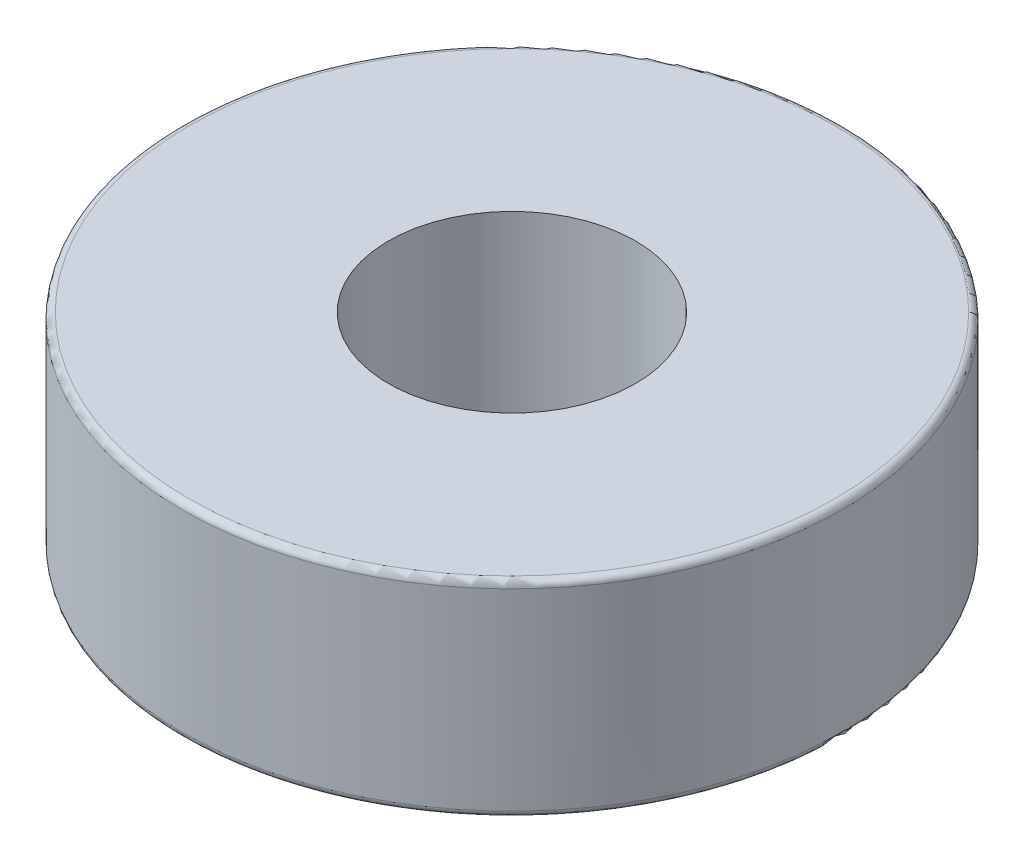
ISO-10303-21;
HEADER;
FILE_DESCRIPTION(('STEP AP214'),'2;1');
FILE_NAME('part.step','',(''),(''),'','','');
FILE_SCHEMA(('AUTOMOTIVE_DESIGN { 1 0 10303 214 1 1 1 1 }'));
ENDSEC;
DATA;
#1=APPLICATION_CONTEXT('core data for automotive mechanical design processes');
#2=APPLICATION_PROTOCOL_DEFINITION('international standard','automotive_design',2000,#1);
#3=PRODUCT_CONTEXT('',#1,'mechanical');
#4=PRODUCT('Part','Part','',(#3));
#5=PRODUCT_RELATED_PRODUCT_CATEGORY('part','',(#4));
#6=PRODUCT_DEFINITION_FORMATION('','',#4);
#7=PRODUCT_DEFINITION_CONTEXT('part definition',#1,'design');
#8=PRODUCT_DEFINITION('design','',#6,#7);
#9=PRODUCT_DEFINITION_SHAPE('','',#8);
#10=(LENGTH_UNIT() NAMED_UNIT(*) SI_UNIT(.MILLI.,.METRE.));
#11=(NAMED_UNIT(*) PLANE_ANGLE_UNIT() SI_UNIT($,.RADIAN.));
#12=(NAMED_UNIT(*) SI_UNIT($,.STERADIAN.) SOLID_ANGLE_UNIT());
#13=UNCERTAINTY_MEASURE_WITH_UNIT(LENGTH_MEASURE(1.E-05),#10,'distance_accuracy_value','');
#14=(GEOMETRIC_REPRESENTATION_CONTEXT(3) GLOBAL_UNCERTAINTY_ASSIGNED_CONTEXT((#13)) GLOBAL_UNIT_ASSIGNED_CONTEXT((#10,
#11,#12)) REPRESENTATION_CONTEXT('',''));
#15=CARTESIAN_POINT('',(0.,0.,0.));
#16=DIRECTION('',(0.,0.,1.));
#17=DIRECTION('',(1.,0.,0.));
#18=AXIS2_PLACEMENT_3D('',#15,#16,#17);
#19=CARTESIAN_POINT('',(0.,6.79943018066803,0.));
#20=DIRECTION('',(0.,-1.,0.));
#21=DIRECTION('',(0.,0.,-1.));
#22=AXIS2_PLACEMENT_3D('',#19,#20,#21);
#23=TOROIDAL_SURFACE('',#22,12.446,0.254);
#24=CARTESIAN_POINT('',(0.,6.79943018066803,0.));
#25=DIRECTION('',(0.,-1.,0.));
#26=DIRECTION('',(0.,0.,-1.));
#27=AXIS2_PLACEMENT_3D('',#24,#25,#26);
#28=CIRCLE('',#27,12.7);
#29=CARTESIAN_POINT('',(0.,6.79943018066803,-12.7));
#30=VERTEX_POINT('',#29);
#31=EDGE_CURVE('E55',#30,#30,#28,.F.);
#32=ORIENTED_EDGE('',*,*,#31,.F.);
#33=EDGE_LOOP('',(#32));
#34=FACE_BOUND('',#33,.T.);
#35=CARTESIAN_POINT('',(0.,6.54543018066803,0.));
#36=DIRECTION('',(0.,1.,0.));
#37=DIRECTION('',(0.,0.,-1.));
#38=AXIS2_PLACEMENT_3D('',#35,#36,#37);
#39=CIRCLE('',#38,12.446);
#40=CARTESIAN_POINT('',(0.,6.54543018066803,12.446));
#41=VERTEX_POINT('',#40);
#42=CARTESIAN_POINT('',(0.,6.54543018066803,-12.446));
#43=VERTEX_POINT('',#42);
#44=EDGE_CURVE('E47',#41,#43,#39,.F.);
#45=ORIENTED_EDGE('',*,*,#44,.F.);
#46=CARTESIAN_POINT('',(0.,6.54543018066803,0.));
#47=DIRECTION('',(0.,1.,0.));
#48=DIRECTION('',(0.,0.,1.));
#49=AXIS2_PLACEMENT_3D('',#46,#47,#48);
#50=CIRCLE('',#49,12.446);
#51=EDGE_CURVE('E45',#43,#41,#50,.F.);
#52=ORIENTED_EDGE('',*,*,#51,.F.);
#53=EDGE_LOOP('',(#45,#52));
#54=FACE_BOUND('',#53,.T.);
#55=ADVANCED_FACE('F17',(#34,#54),#23,.T.);
#56=CARTESIAN_POINT('',(0.,0.,0.));
#57=DIRECTION('',(0.,-1.,0.));
#58=DIRECTION('',(0.,0.,-1.));
#59=AXIS2_PLACEMENT_3D('',#56,#57,#58);
#60=CYLINDRICAL_SURFACE('',#59,12.7);
#61=CARTESIAN_POINT('',(0.,14.216230180668,0.));
#62=DIRECTION('',(0.,1.,0.));
#63=DIRECTION('',(0.,0.,1.));
#64=AXIS2_PLACEMENT_3D('',#61,#62,#63);
#65=CIRCLE('',#64,12.7);
#66=CARTESIAN_POINT('',(0.,14.216230180668,12.7));
#67=VERTEX_POINT('',#66);
#68=EDGE_CURVE('E51',#67,#67,#65,.T.);
#69=ORIENTED_EDGE('',*,*,#68,.F.);
#70=EDGE_LOOP('',(#69));
#71=FACE_BOUND('',#70,.T.);
#72=ORIENTED_EDGE('',*,*,#31,.T.);
#73=EDGE_LOOP('',(#72));
#74=FACE_BOUND('',#73,.T.);
#75=ADVANCED_FACE('F73',(#71,#74),#60,.T.);
#76=CARTESIAN_POINT('',(4.7625,6.54543018066803,0.));
#77=DIRECTION('',(0.,-1.,0.));
#78=DIRECTION('',(0.,0.,-1.));
#79=AXIS2_PLACEMENT_3D('',#76,#77,#78);
#80=PLANE('',#79);
#81=CARTESIAN_POINT('',(0.,6.54543018066803,0.));
#82=DIRECTION('',(0.,-1.,0.));
#83=DIRECTION('',(0.,0.,-1.));
#84=AXIS2_PLACEMENT_3D('',#81,#82,#83);
#85=CIRCLE('',#84,4.7625);
#86=CARTESIAN_POINT('',(0.,6.54543018066803,-4.7625));
#87=VERTEX_POINT('',#86);
#88=EDGE_CURVE('E88',#87,#87,#85,.F.);
#89=ORIENTED_EDGE('',*,*,#88,.T.);
#90=EDGE_LOOP('',(#89));
#91=FACE_BOUND('',#90,.T.);
#92=ORIENTED_EDGE('',*,*,#51,.T.);
#93=ORIENTED_EDGE('',*,*,#44,.T.);
#94=EDGE_LOOP('',(#92,#93));
#95=FACE_BOUND('',#94,.T.);
#96=ADVANCED_FACE('F54',(#91,#95),#80,.T.);
#97=CARTESIAN_POINT('',(0.,14.216230180668,0.));
#98=DIRECTION('',(0.,1.,0.));
#99=DIRECTION('',(0.,0.,1.));
#100=AXIS2_PLACEMENT_3D('',#97,#98,#99);
#101=TOROIDAL_SURFACE('',#100,12.446,0.254);
#102=ORIENTED_EDGE('',*,*,#68,.T.);
#103=EDGE_LOOP('',(#102));
#104=FACE_BOUND('',#103,.T.);
#105=CARTESIAN_POINT('',(0.,14.470230180668,0.));
#106=DIRECTION('',(0.,-1.,0.));
#107=DIRECTION('',(0.,0.,1.));
#108=AXIS2_PLACEMENT_3D('',#105,#106,#107);
#109=CIRCLE('',#108,12.446);
#110=CARTESIAN_POINT('',(0.,14.470230180668,-12.446));
#111=VERTEX_POINT('',#110);
#112=CARTESIAN_POINT('',(0.,14.470230180668,12.446));
#113=VERTEX_POINT('',#112);
#114=EDGE_CURVE('E29',#111,#113,#109,.F.);
#115=ORIENTED_EDGE('',*,*,#114,.F.);
#116=CARTESIAN_POINT('',(0.,14.470230180668,0.));
#117=DIRECTION('',(0.,-1.,0.));
#118=DIRECTION('',(0.,0.,-1.));
#119=AXIS2_PLACEMENT_3D('',#116,#117,#118);
#120=CIRCLE('',#119,12.446);
#121=EDGE_CURVE('E93',#113,#111,#120,.F.);
#122=ORIENTED_EDGE('',*,*,#121,.F.);
#123=EDGE_LOOP('',(#115,#122));
#124=FACE_BOUND('',#123,.T.);
#125=ADVANCED_FACE('F72',(#104,#124),#101,.T.);
#126=CARTESIAN_POINT('',(0.,0.,0.));
#127=DIRECTION('',(0.,-1.,0.));
#128=DIRECTION('',(0.,0.,-1.));
#129=AXIS2_PLACEMENT_3D('',#126,#127,#128);
#130=CYLINDRICAL_SURFACE('',#129,4.7625);
#131=ORIENTED_EDGE('',*,*,#88,.F.);
#132=EDGE_LOOP('',(#131));
#133=FACE_BOUND('',#132,.T.);
#134=CARTESIAN_POINT('',(0.,14.470230180668,0.));
#135=DIRECTION('',(0.,-1.,0.));
#136=DIRECTION('',(0.,0.,-1.));
#137=AXIS2_PLACEMENT_3D('',#134,#135,#136);
#138=CIRCLE('',#137,4.7625);
#139=CARTESIAN_POINT('',(0.,14.470230180668,-4.7625));
#140=VERTEX_POINT('',#139);
#141=EDGE_CURVE('E10',#140,#140,#138,.T.);
#142=ORIENTED_EDGE('',*,*,#141,.F.);
#143=EDGE_LOOP('',(#142));
#144=FACE_BOUND('',#143,.T.);
#145=ADVANCED_FACE('F125',(#133,#144),#130,.F.);
#146=CARTESIAN_POINT('',(4.7625,14.470230180668,0.));
#147=DIRECTION('',(0.,1.,0.));
#148=DIRECTION('',(0.,0.,1.));
#149=AXIS2_PLACEMENT_3D('',#146,#147,#148);
#150=PLANE('',#149);
#151=ORIENTED_EDGE('',*,*,#141,.T.);
#152=EDGE_LOOP('',(#151));
#153=FACE_BOUND('',#152,.T.);
#154=ORIENTED_EDGE('',*,*,#121,.T.);
#155=ORIENTED_EDGE('',*,*,#114,.T.);
#156=EDGE_LOOP('',(#154,#155));
#157=FACE_BOUND('',#156,.T.);
#158=ADVANCED_FACE('F109',(#153,#157),#150,.T.);
#159=CLOSED_SHELL('',(#55,#75,#96,#125,#145,#158));
#160=MANIFOLD_SOLID_BREP('B1',#159);
#161=ADVANCED_BREP_SHAPE_REPRESENTATION('',(#18,#160),#14);
#162=SHAPE_DEFINITION_REPRESENTATION(#9,#161);
ENDSEC;
END-ISO-10303-21;
